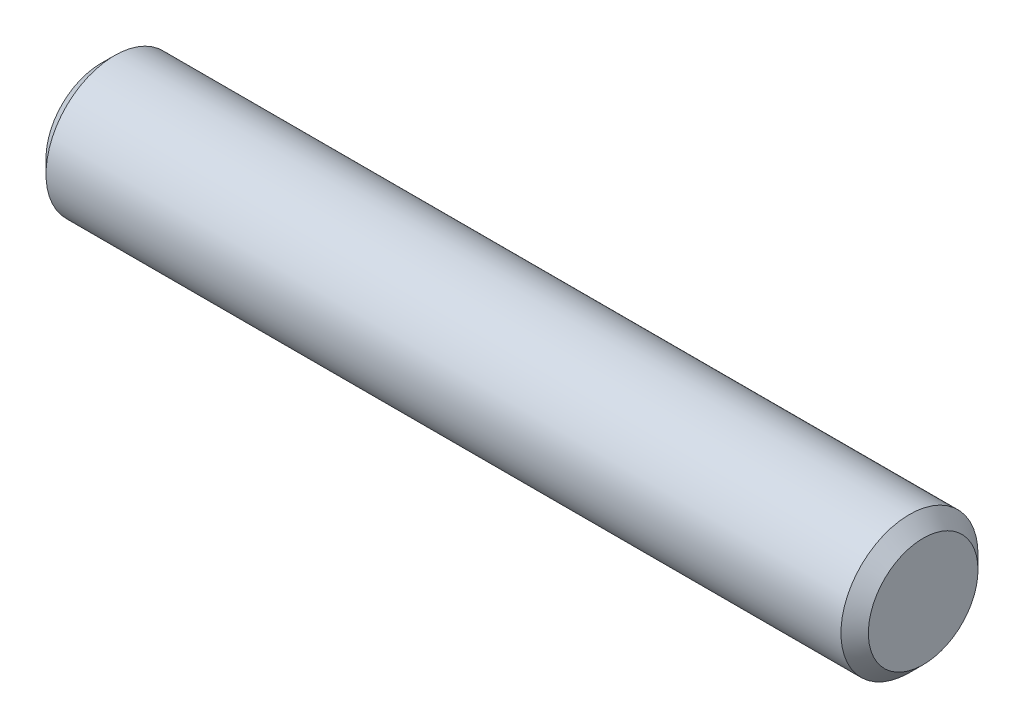
ISO-10303-21;
HEADER;
FILE_DESCRIPTION(('STEP AP214'),'2;1');
FILE_NAME('part.step','',(''),(''),'','','');
FILE_SCHEMA(('AUTOMOTIVE_DESIGN { 1 0 10303 214 1 1 1 1 }'));
ENDSEC;
DATA;
#1=APPLICATION_CONTEXT('core data for automotive mechanical design processes');
#2=APPLICATION_PROTOCOL_DEFINITION('international standard','automotive_design',2000,#1);
#3=PRODUCT_CONTEXT('',#1,'mechanical');
#4=PRODUCT('Part','Part','',(#3));
#5=PRODUCT_RELATED_PRODUCT_CATEGORY('part','',(#4));
#6=PRODUCT_DEFINITION_FORMATION('','',#4);
#7=PRODUCT_DEFINITION_CONTEXT('part definition',#1,'design');
#8=PRODUCT_DEFINITION('design','',#6,#7);
#9=PRODUCT_DEFINITION_SHAPE('','',#8);
#10=(LENGTH_UNIT() NAMED_UNIT(*) SI_UNIT(.MILLI.,.METRE.));
#11=(NAMED_UNIT(*) PLANE_ANGLE_UNIT() SI_UNIT($,.RADIAN.));
#12=(NAMED_UNIT(*) SI_UNIT($,.STERADIAN.) SOLID_ANGLE_UNIT());
#13=UNCERTAINTY_MEASURE_WITH_UNIT(LENGTH_MEASURE(1.E-05),#10,'distance_accuracy_value','');
#14=(GEOMETRIC_REPRESENTATION_CONTEXT(3) GLOBAL_UNCERTAINTY_ASSIGNED_CONTEXT((#13)) GLOBAL_UNIT_ASSIGNED_CONTEXT((#10,
#11,#12)) REPRESENTATION_CONTEXT('',''));
#15=CARTESIAN_POINT('',(0.,0.,0.));
#16=DIRECTION('',(0.,0.,1.));
#17=DIRECTION('',(1.,0.,0.));
#18=AXIS2_PLACEMENT_3D('',#15,#16,#17);
#19=CARTESIAN_POINT('',(-19.05,0.,0.));
#20=DIRECTION('',(1.,0.,0.));
#21=DIRECTION('',(0.,0.,-1.));
#22=AXIS2_PLACEMENT_3D('',#19,#20,#21);
#23=CYLINDRICAL_SURFACE('',#22,3.175);
#24=CARTESIAN_POINT('',(18.415,0.,0.));
#25=DIRECTION('',(1.,0.,0.));
#26=DIRECTION('',(0.,0.,-1.));
#27=AXIS2_PLACEMENT_3D('',#24,#25,#26);
#28=CIRCLE('',#27,3.175);
#29=CARTESIAN_POINT('',(18.415,0.,-3.175));
#30=VERTEX_POINT('',#29);
#31=EDGE_CURVE('E39',#30,#30,#28,.F.);
#32=CARTESIAN_POINT('',(-18.415,0.,0.));
#33=DIRECTION('',(1.,0.,0.));
#34=DIRECTION('',(0.,0.,-1.));
#35=AXIS2_PLACEMENT_3D('',#32,#33,#34);
#36=CIRCLE('',#35,3.175);
#37=CARTESIAN_POINT('',(-18.415,0.,-3.175));
#38=VERTEX_POINT('',#37);
#39=EDGE_CURVE('E43',#38,#38,#36,.T.);
#40=CARTESIAN_POINT('',(18.415,0.,-3.175));
#41=CARTESIAN_POINT('',(18.0313541666667,0.,-3.175));
#42=CARTESIAN_POINT('',(17.6477083333333,0.,-3.175));
#43=CARTESIAN_POINT('',(16.8804166666667,0.,-3.175));
#44=CARTESIAN_POINT('',(16.4967708333333,0.,-3.175));
#45=CARTESIAN_POINT('',(15.7294791666667,0.,-3.175));
#46=CARTESIAN_POINT('',(15.3458333333333,0.,-3.175));
#47=CARTESIAN_POINT('',(14.5785416666667,0.,-3.175));
#48=CARTESIAN_POINT('',(14.1948958333333,0.,-3.175));
#49=CARTESIAN_POINT('',(13.4276041666667,0.,-3.175));
#50=CARTESIAN_POINT('',(13.0439583333333,0.,-3.175));
#51=CARTESIAN_POINT('',(12.2766666666667,0.,-3.175));
#52=CARTESIAN_POINT('',(11.8930208333333,0.,-3.175));
#53=CARTESIAN_POINT('',(11.1257291666667,0.,-3.175));
#54=CARTESIAN_POINT('',(10.7420833333333,0.,-3.175));
#55=CARTESIAN_POINT('',(9.97479166666668,0.,-3.175));
#56=CARTESIAN_POINT('',(9.59114583333334,0.,-3.175));
#57=CARTESIAN_POINT('',(8.82385416666668,0.,-3.175));
#58=CARTESIAN_POINT('',(8.44020833333334,0.,-3.175));
#59=CARTESIAN_POINT('',(7.67291666666668,0.,-3.175));
#60=CARTESIAN_POINT('',(7.28927083333334,0.,-3.175));
#61=CARTESIAN_POINT('',(6.52197916666668,0.,-3.175));
#62=CARTESIAN_POINT('',(6.13833333333335,0.,-3.175));
#63=CARTESIAN_POINT('',(5.37104166666668,0.,-3.175));
#64=CARTESIAN_POINT('',(4.98739583333334,0.,-3.175));
#65=CARTESIAN_POINT('',(4.22010416666668,0.,-3.175));
#66=CARTESIAN_POINT('',(3.83645833333335,0.,-3.175));
#67=CARTESIAN_POINT('',(3.06916666666668,0.,-3.175));
#68=CARTESIAN_POINT('',(2.68552083333335,0.,-3.175));
#69=CARTESIAN_POINT('',(1.91822916666668,0.,-3.175));
#70=CARTESIAN_POINT('',(1.53458333333335,0.,-3.175));
#71=CARTESIAN_POINT('',(0.767291666666681,0.,-3.175));
#72=CARTESIAN_POINT('',(0.383645833333348,0.,-3.175));
#73=CARTESIAN_POINT('',(-0.38364583333332,0.,-3.175));
#74=CARTESIAN_POINT('',(-0.767291666666653,0.,-3.175));
#75=CARTESIAN_POINT('',(-1.53458333333332,0.,-3.175));
#76=CARTESIAN_POINT('',(-1.91822916666665,0.,-3.175));
#77=CARTESIAN_POINT('',(-2.68552083333332,0.,-3.175));
#78=CARTESIAN_POINT('',(-3.06916666666665,0.,-3.175));
#79=CARTESIAN_POINT('',(-3.83645833333332,0.,-3.175));
#80=CARTESIAN_POINT('',(-4.22010416666665,0.,-3.175));
#81=CARTESIAN_POINT('',(-4.98739583333332,0.,-3.175));
#82=CARTESIAN_POINT('',(-5.37104166666665,0.,-3.175));
#83=CARTESIAN_POINT('',(-6.13833333333332,0.,-3.175));
#84=CARTESIAN_POINT('',(-6.52197916666665,0.,-3.175));
#85=CARTESIAN_POINT('',(-7.28927083333332,0.,-3.175));
#86=CARTESIAN_POINT('',(-7.67291666666665,0.,-3.175));
#87=CARTESIAN_POINT('',(-8.44020833333331,0.,-3.175));
#88=CARTESIAN_POINT('',(-8.82385416666665,0.,-3.175));
#89=CARTESIAN_POINT('',(-9.59114583333331,0.,-3.175));
#90=CARTESIAN_POINT('',(-9.97479166666665,0.,-3.175));
#91=CARTESIAN_POINT('',(-10.7420833333333,0.,-3.175));
#92=CARTESIAN_POINT('',(-11.1257291666666,0.,-3.175));
#93=CARTESIAN_POINT('',(-11.8930208333333,0.,-3.175));
#94=CARTESIAN_POINT('',(-12.2766666666666,0.,-3.175));
#95=CARTESIAN_POINT('',(-13.0439583333333,0.,-3.175));
#96=CARTESIAN_POINT('',(-13.4276041666666,0.,-3.175));
#97=CARTESIAN_POINT('',(-14.1948958333333,0.,-3.175));
#98=CARTESIAN_POINT('',(-14.5785416666666,0.,-3.175));
#99=CARTESIAN_POINT('',(-15.3458333333333,0.,-3.175));
#100=CARTESIAN_POINT('',(-15.7294791666666,0.,-3.175));
#101=CARTESIAN_POINT('',(-16.4967708333333,0.,-3.175));
#102=CARTESIAN_POINT('',(-16.8804166666666,0.,-3.175));
#103=CARTESIAN_POINT('',(-17.6477083333333,0.,-3.175));
#104=CARTESIAN_POINT('',(-18.0313541666666,0.,-3.175));
#105=CARTESIAN_POINT('',(-18.415,0.,-3.175));
#106=B_SPLINE_CURVE_WITH_KNOTS('',3,(#40,#41,#42,#43,#44,#45,#46,#47,#48,#49,#50,#51,#52,#53,
#54,#55,#56,#57,#58,#59,#60,#61,#62,#63,#64,#65,#66,#67,#68,#69,#70,#71,#72,#73,#74,#75,#76,#77,
#78,#79,#80,#81,#82,#83,#84,#85,#86,#87,#88,#89,#90,#91,#92,#93,#94,#95,#96,#97,#98,#99,#100,
#101,#102,#103,#104,#105),.UNSPECIFIED.,.F.,.F.,(4,2,2,2,2,2,2,2,2,2,2,2,2,2,2,2,2,2,2,2,2,2,2,
2,2,2,2,2,2,2,2,2,4),(0.,1.1509375,2.301875,3.4528125,4.60375,5.75468749999999,6.905625,
8.05656249999999,9.20749999999999,10.3584375,11.509375,12.6603125,13.81125,14.9621875,16.113125,
17.2640625,18.415,19.5659375,20.716875,21.8678125,23.01875,24.1696875,25.320625,26.4715625,
27.6225,28.7734375,29.924375,31.0753125,32.22625,33.3771875,34.528125,35.6790625,36.83),.UNSPECIFIED.);
#107=EDGE_CURVE('BSEAM32',#30,#38,#106,.T.);
#108=ORIENTED_EDGE('',*,*,#31,.T.);
#109=ORIENTED_EDGE('',*,*,#39,.T.);
#110=ORIENTED_EDGE('',*,*,#107,.T.);
#111=ORIENTED_EDGE('',*,*,#107,.F.);
#112=EDGE_LOOP('',(#108,#110,#109,#111));
#113=FACE_BOUND('',#112,.T.);
#114=ADVANCED_FACE('F32',(#113),#23,.T.);
#115=CARTESIAN_POINT('',(-19.05,0.,0.));
#116=DIRECTION('',(1.,0.,0.));
#117=DIRECTION('',(0.,0.,-1.));
#118=AXIS2_PLACEMENT_3D('',#115,#116,#117);
#119=PLANE('',#118);
#120=CARTESIAN_POINT('',(-19.05,0.,0.));
#121=DIRECTION('',(1.,0.,0.));
#122=DIRECTION('',(0.,0.,-1.));
#123=AXIS2_PLACEMENT_3D('',#120,#121,#122);
#124=CIRCLE('',#123,2.53999999999997);
#125=CARTESIAN_POINT('',(-19.05,0.,-2.53999999999997));
#126=VERTEX_POINT('',#125);
#127=EDGE_CURVE('E10',#126,#126,#124,.F.);
#128=ORIENTED_EDGE('',*,*,#127,.T.);
#129=EDGE_LOOP('',(#128));
#130=FACE_BOUND('',#129,.T.);
#131=ADVANCED_FACE('F63',(#130),#119,.F.);
#132=CARTESIAN_POINT('',(19.05,0.,0.));
#133=DIRECTION('',(1.,0.,0.));
#134=DIRECTION('',(0.,0.,-1.));
#135=AXIS2_PLACEMENT_3D('',#132,#133,#134);
#136=PLANE('',#135);
#137=CARTESIAN_POINT('',(19.05,0.,0.));
#138=DIRECTION('',(1.,0.,0.));
#139=DIRECTION('',(0.,0.,-1.));
#140=AXIS2_PLACEMENT_3D('',#137,#138,#139);
#141=CIRCLE('',#140,2.54000000000001);
#142=CARTESIAN_POINT('',(19.05,0.,-2.54000000000001));
#143=VERTEX_POINT('',#142);
#144=EDGE_CURVE('E47',#143,#143,#141,.T.);
#145=ORIENTED_EDGE('',*,*,#144,.T.);
#146=EDGE_LOOP('',(#145));
#147=FACE_BOUND('',#146,.T.);
#148=ADVANCED_FACE('F53',(#147),#136,.T.);
#149=CARTESIAN_POINT('',(19.05,0.,0.));
#150=DIRECTION('',(-1.,0.,0.));
#151=DIRECTION('',(0.,0.,1.));
#152=AXIS2_PLACEMENT_3D('',#149,#150,#151);
#153=CONICAL_SURFACE('',#152,2.54000000000001,0.785398163397451);
#154=ORIENTED_EDGE('',*,*,#31,.F.);
#155=EDGE_LOOP('',(#154));
#156=FACE_BOUND('',#155,.T.);
#157=ORIENTED_EDGE('',*,*,#144,.F.);
#158=EDGE_LOOP('',(#157));
#159=FACE_BOUND('',#158,.T.);
#160=ADVANCED_FACE('F55',(#156,#159),#153,.T.);
#161=CARTESIAN_POINT('',(-18.415,0.,0.));
#162=DIRECTION('',(1.,0.,0.));
#163=DIRECTION('',(0.,0.,-1.));
#164=AXIS2_PLACEMENT_3D('',#161,#162,#163);
#165=CONICAL_SURFACE('',#164,3.175,0.785398163397453);
#166=ORIENTED_EDGE('',*,*,#127,.F.);
#167=EDGE_LOOP('',(#166));
#168=FACE_BOUND('',#167,.T.);
#169=ORIENTED_EDGE('',*,*,#39,.F.);
#170=EDGE_LOOP('',(#169));
#171=FACE_BOUND('',#170,.T.);
#172=ADVANCED_FACE('F34',(#168,#171),#165,.T.);
#173=CLOSED_SHELL('',(#114,#131,#148,#160,#172));
#174=MANIFOLD_SOLID_BREP('B2',#173);
#175=ADVANCED_BREP_SHAPE_REPRESENTATION('',(#18,#174),#14);
#176=SHAPE_DEFINITION_REPRESENTATION(#9,#175);
ENDSEC;
END-ISO-10303-21;
